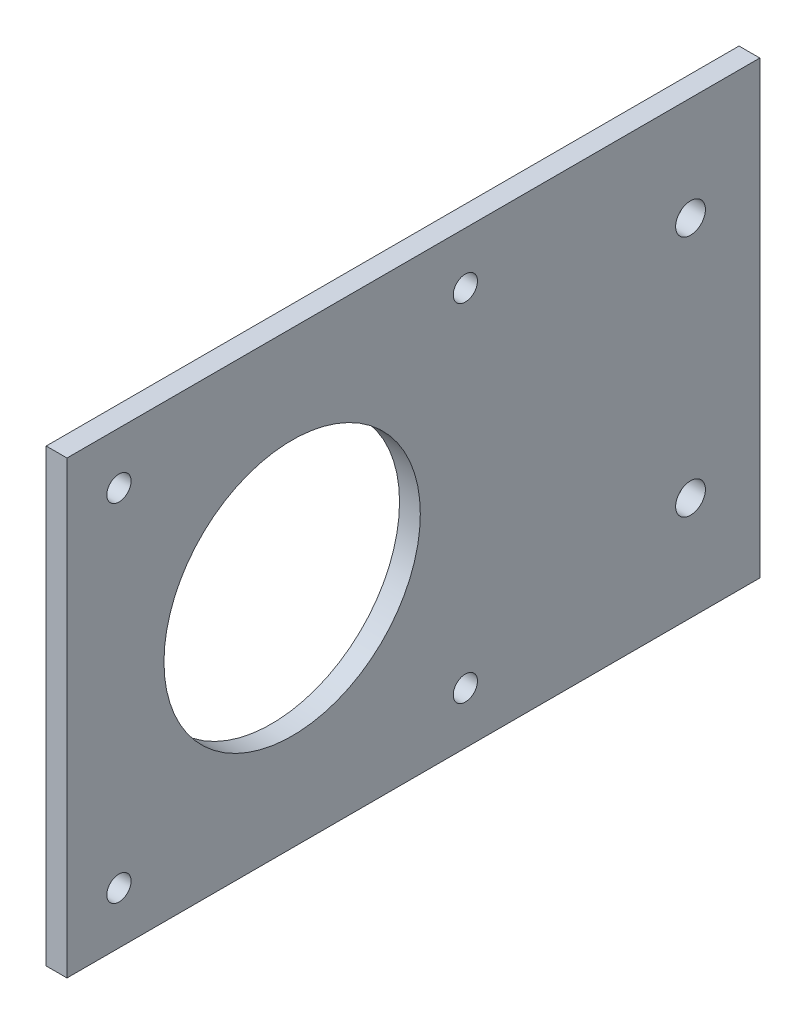
ISO-10303-21;
HEADER;
FILE_DESCRIPTION(('STEP AP214'),'2;1');
FILE_NAME('part.step','',(''),(''),'','','');
FILE_SCHEMA(('AUTOMOTIVE_DESIGN { 1 0 10303 214 1 1 1 1 }'));
ENDSEC;
DATA;
#1=APPLICATION_CONTEXT('core data for automotive mechanical design processes');
#2=APPLICATION_PROTOCOL_DEFINITION('international standard','automotive_design',2000,#1);
#3=PRODUCT_CONTEXT('',#1,'mechanical');
#4=PRODUCT('Part','Part','',(#3));
#5=PRODUCT_RELATED_PRODUCT_CATEGORY('part','',(#4));
#6=PRODUCT_DEFINITION_FORMATION('','',#4);
#7=PRODUCT_DEFINITION_CONTEXT('part definition',#1,'design');
#8=PRODUCT_DEFINITION('design','',#6,#7);
#9=PRODUCT_DEFINITION_SHAPE('','',#8);
#10=(LENGTH_UNIT() NAMED_UNIT(*) SI_UNIT(.MILLI.,.METRE.));
#11=(NAMED_UNIT(*) PLANE_ANGLE_UNIT() SI_UNIT($,.RADIAN.));
#12=(NAMED_UNIT(*) SI_UNIT($,.STERADIAN.) SOLID_ANGLE_UNIT());
#13=UNCERTAINTY_MEASURE_WITH_UNIT(LENGTH_MEASURE(1.E-05),#10,'distance_accuracy_value','');
#14=(GEOMETRIC_REPRESENTATION_CONTEXT(3) GLOBAL_UNCERTAINTY_ASSIGNED_CONTEXT((#13)) GLOBAL_UNIT_ASSIGNED_CONTEXT((#10,
#11,#12)) REPRESENTATION_CONTEXT('',''));
#15=CARTESIAN_POINT('',(0.,0.,0.));
#16=DIRECTION('',(0.,0.,1.));
#17=DIRECTION('',(1.,0.,0.));
#18=AXIS2_PLACEMENT_3D('',#15,#16,#17);
#19=CARTESIAN_POINT('',(3.,0.,0.));
#20=DIRECTION('',(-1.,0.,0.));
#21=DIRECTION('',(0.,0.,1.));
#22=AXIS2_PLACEMENT_3D('',#19,#20,#21);
#23=PLANE('',#22);
#24=DIRECTION('',(0.,-1.,0.));
#25=VECTOR('',#24,1.);
#26=CARTESIAN_POINT('',(3.,0.,0.));
#27=LINE('',#26,#25);
#28=CARTESIAN_POINT('',(3.,65.,0.));
#29=VERTEX_POINT('',#28);
#30=CARTESIAN_POINT('',(3.,0.,0.));
#31=VERTEX_POINT('',#30);
#32=EDGE_CURVE('E102',#29,#31,#27,.T.);
#33=ORIENTED_EDGE('',*,*,#32,.T.);
#34=DIRECTION('',(0.,0.,-1.));
#35=VECTOR('',#34,1.);
#36=CARTESIAN_POINT('',(3.,0.,0.));
#37=LINE('',#36,#35);
#38=CARTESIAN_POINT('',(3.,0.,-100.));
#39=VERTEX_POINT('',#38);
#40=EDGE_CURVE('E97',#31,#39,#37,.T.);
#41=ORIENTED_EDGE('',*,*,#40,.T.);
#42=DIRECTION('',(0.,1.,0.));
#43=VECTOR('',#42,1.);
#44=CARTESIAN_POINT('',(3.,0.,-100.));
#45=LINE('',#44,#43);
#46=CARTESIAN_POINT('',(3.,65.,-100.));
#47=VERTEX_POINT('',#46);
#48=EDGE_CURVE('E100',#39,#47,#45,.T.);
#49=ORIENTED_EDGE('',*,*,#48,.T.);
#50=DIRECTION('',(0.,0.,1.));
#51=VECTOR('',#50,1.);
#52=CARTESIAN_POINT('',(3.,65.,0.));
#53=LINE('',#52,#51);
#54=EDGE_CURVE('E63',#47,#29,#53,.T.);
#55=ORIENTED_EDGE('',*,*,#54,.T.);
#56=EDGE_LOOP('',(#33,#41,#49,#55));
#57=FACE_BOUND('',#56,.T.);
#58=CARTESIAN_POINT('',(3.,32.5,-32.5));
#59=DIRECTION('',(1.,0.,0.));
#60=DIRECTION('',(0.,0.,-1.));
#61=AXIS2_PLACEMENT_3D('',#58,#59,#60);
#62=CIRCLE('',#61,18.5);
#63=CARTESIAN_POINT('',(3.,32.5,-51.));
#64=VERTEX_POINT('',#63);
#65=EDGE_CURVE('E123',#64,#64,#62,.T.);
#66=ORIENTED_EDGE('',*,*,#65,.F.);
#67=EDGE_LOOP('',(#66));
#68=FACE_BOUND('',#67,.T.);
#69=CARTESIAN_POINT('',(3.,57.5,-7.5));
#70=DIRECTION('',(1.,0.,0.));
#71=DIRECTION('',(0.,0.,-1.));
#72=AXIS2_PLACEMENT_3D('',#69,#70,#71);
#73=CIRCLE('',#72,1.75);
#74=CARTESIAN_POINT('',(3.,57.5,-9.25));
#75=VERTEX_POINT('',#74);
#76=EDGE_CURVE('E145',#75,#75,#73,.T.);
#77=ORIENTED_EDGE('',*,*,#76,.F.);
#78=EDGE_LOOP('',(#77));
#79=FACE_BOUND('',#78,.T.);
#80=CARTESIAN_POINT('',(3.,57.5,-57.5));
#81=DIRECTION('',(1.,0.,0.));
#82=DIRECTION('',(0.,0.,-1.));
#83=AXIS2_PLACEMENT_3D('',#80,#81,#82);
#84=CIRCLE('',#83,1.75);
#85=CARTESIAN_POINT('',(3.,57.5,-59.25));
#86=VERTEX_POINT('',#85);
#87=EDGE_CURVE('E152',#86,#86,#84,.T.);
#88=ORIENTED_EDGE('',*,*,#87,.F.);
#89=EDGE_LOOP('',(#88));
#90=FACE_BOUND('',#89,.T.);
#91=CARTESIAN_POINT('',(3.,7.5,-7.5));
#92=DIRECTION('',(1.,0.,0.));
#93=DIRECTION('',(0.,0.,-1.));
#94=AXIS2_PLACEMENT_3D('',#91,#92,#93);
#95=CIRCLE('',#94,1.75);
#96=CARTESIAN_POINT('',(3.,7.5,-9.25));
#97=VERTEX_POINT('',#96);
#98=EDGE_CURVE('E160',#97,#97,#95,.T.);
#99=ORIENTED_EDGE('',*,*,#98,.F.);
#100=EDGE_LOOP('',(#99));
#101=FACE_BOUND('',#100,.T.);
#102=CARTESIAN_POINT('',(3.,7.5,-57.5));
#103=DIRECTION('',(1.,0.,0.));
#104=DIRECTION('',(0.,0.,-1.));
#105=AXIS2_PLACEMENT_3D('',#102,#103,#104);
#106=CIRCLE('',#105,1.75);
#107=CARTESIAN_POINT('',(3.,7.5,-59.25));
#108=VERTEX_POINT('',#107);
#109=EDGE_CURVE('E167',#108,#108,#106,.T.);
#110=ORIENTED_EDGE('',*,*,#109,.F.);
#111=EDGE_LOOP('',(#110));
#112=FACE_BOUND('',#111,.T.);
#113=CARTESIAN_POINT('',(3.,50.,-90.));
#114=DIRECTION('',(1.,0.,0.));
#115=DIRECTION('',(0.,0.,-1.));
#116=AXIS2_PLACEMENT_3D('',#113,#114,#115);
#117=CIRCLE('',#116,2.15);
#118=CARTESIAN_POINT('',(3.,50.,-92.15));
#119=VERTEX_POINT('',#118);
#120=EDGE_CURVE('E173',#119,#119,#117,.T.);
#121=ORIENTED_EDGE('',*,*,#120,.F.);
#122=EDGE_LOOP('',(#121));
#123=FACE_BOUND('',#122,.T.);
#124=CARTESIAN_POINT('',(3.,15.,-90.));
#125=DIRECTION('',(1.,0.,0.));
#126=DIRECTION('',(0.,0.,-1.));
#127=AXIS2_PLACEMENT_3D('',#124,#125,#126);
#128=CIRCLE('',#127,2.15);
#129=CARTESIAN_POINT('',(3.,15.,-92.15));
#130=VERTEX_POINT('',#129);
#131=EDGE_CURVE('E180',#130,#130,#128,.T.);
#132=ORIENTED_EDGE('',*,*,#131,.F.);
#133=EDGE_LOOP('',(#132));
#134=FACE_BOUND('',#133,.T.);
#135=ADVANCED_FACE('F44',(#57,#68,#79,#90,#101,#112,#123,#134),#23,.F.);
#136=CARTESIAN_POINT('',(0.,0.,0.));
#137=DIRECTION('',(-1.,0.,0.));
#138=DIRECTION('',(0.,0.,1.));
#139=AXIS2_PLACEMENT_3D('',#136,#137,#138);
#140=PLANE('',#139);
#141=CARTESIAN_POINT('',(0.,50.,-90.));
#142=DIRECTION('',(1.,0.,0.));
#143=DIRECTION('',(0.,0.,-1.));
#144=AXIS2_PLACEMENT_3D('',#141,#142,#143);
#145=CIRCLE('',#144,2.15);
#146=CARTESIAN_POINT('',(0.,50.,-92.15));
#147=VERTEX_POINT('',#146);
#148=EDGE_CURVE('E176',#147,#147,#145,.T.);
#149=ORIENTED_EDGE('',*,*,#148,.T.);
#150=EDGE_LOOP('',(#149));
#151=FACE_BOUND('',#150,.T.);
#152=CARTESIAN_POINT('',(0.,7.5,-7.5));
#153=DIRECTION('',(1.,0.,0.));
#154=DIRECTION('',(0.,0.,-1.));
#155=AXIS2_PLACEMENT_3D('',#152,#153,#154);
#156=CIRCLE('',#155,1.75);
#157=CARTESIAN_POINT('',(0.,7.5,-9.25));
#158=VERTEX_POINT('',#157);
#159=EDGE_CURVE('E164',#158,#158,#156,.T.);
#160=ORIENTED_EDGE('',*,*,#159,.T.);
#161=EDGE_LOOP('',(#160));
#162=FACE_BOUND('',#161,.T.);
#163=CARTESIAN_POINT('',(0.,57.5,-7.5));
#164=DIRECTION('',(1.,0.,0.));
#165=DIRECTION('',(0.,0.,-1.));
#166=AXIS2_PLACEMENT_3D('',#163,#164,#165);
#167=CIRCLE('',#166,1.75);
#168=CARTESIAN_POINT('',(0.,57.5,-9.25));
#169=VERTEX_POINT('',#168);
#170=EDGE_CURVE('E149',#169,#169,#167,.T.);
#171=ORIENTED_EDGE('',*,*,#170,.T.);
#172=EDGE_LOOP('',(#171));
#173=FACE_BOUND('',#172,.T.);
#174=DIRECTION('',(0.,-1.,0.));
#175=VECTOR('',#174,1.);
#176=CARTESIAN_POINT('',(0.,0.,0.));
#177=LINE('',#176,#175);
#178=CARTESIAN_POINT('',(0.,65.,0.));
#179=VERTEX_POINT('',#178);
#180=CARTESIAN_POINT('',(0.,0.,0.));
#181=VERTEX_POINT('',#180);
#182=EDGE_CURVE('E120',#179,#181,#177,.T.);
#183=ORIENTED_EDGE('',*,*,#182,.F.);
#184=DIRECTION('',(0.,0.,1.));
#185=VECTOR('',#184,1.);
#186=CARTESIAN_POINT('',(0.,65.,0.));
#187=LINE('',#186,#185);
#188=CARTESIAN_POINT('',(0.,65.,-100.));
#189=VERTEX_POINT('',#188);
#190=EDGE_CURVE('E90',#189,#179,#187,.T.);
#191=ORIENTED_EDGE('',*,*,#190,.F.);
#192=DIRECTION('',(0.,1.,0.));
#193=VECTOR('',#192,1.);
#194=CARTESIAN_POINT('',(0.,0.,-100.));
#195=LINE('',#194,#193);
#196=CARTESIAN_POINT('',(0.,0.,-100.));
#197=VERTEX_POINT('',#196);
#198=EDGE_CURVE('E84',#197,#189,#195,.T.);
#199=ORIENTED_EDGE('',*,*,#198,.F.);
#200=DIRECTION('',(0.,0.,-1.));
#201=VECTOR('',#200,1.);
#202=CARTESIAN_POINT('',(0.,0.,0.));
#203=LINE('',#202,#201);
#204=EDGE_CURVE('E107',#181,#197,#203,.T.);
#205=ORIENTED_EDGE('',*,*,#204,.F.);
#206=EDGE_LOOP('',(#183,#191,#199,#205));
#207=FACE_BOUND('',#206,.T.);
#208=CARTESIAN_POINT('',(0.,32.5,-32.5));
#209=DIRECTION('',(1.,0.,0.));
#210=DIRECTION('',(0.,0.,-1.));
#211=AXIS2_PLACEMENT_3D('',#208,#209,#210);
#212=CIRCLE('',#211,18.5);
#213=CARTESIAN_POINT('',(0.,32.5,-51.));
#214=VERTEX_POINT('',#213);
#215=EDGE_CURVE('E141',#214,#214,#212,.T.);
#216=ORIENTED_EDGE('',*,*,#215,.T.);
#217=EDGE_LOOP('',(#216));
#218=FACE_BOUND('',#217,.T.);
#219=CARTESIAN_POINT('',(0.,57.5,-57.5));
#220=DIRECTION('',(1.,0.,0.));
#221=DIRECTION('',(0.,0.,-1.));
#222=AXIS2_PLACEMENT_3D('',#219,#220,#221);
#223=CIRCLE('',#222,1.75);
#224=CARTESIAN_POINT('',(0.,57.5,-59.25));
#225=VERTEX_POINT('',#224);
#226=EDGE_CURVE('E156',#225,#225,#223,.T.);
#227=ORIENTED_EDGE('',*,*,#226,.T.);
#228=EDGE_LOOP('',(#227));
#229=FACE_BOUND('',#228,.T.);
#230=CARTESIAN_POINT('',(0.,7.5,-57.5));
#231=DIRECTION('',(1.,0.,0.));
#232=DIRECTION('',(0.,0.,-1.));
#233=AXIS2_PLACEMENT_3D('',#230,#231,#232);
#234=CIRCLE('',#233,1.75);
#235=CARTESIAN_POINT('',(0.,7.5,-59.25));
#236=VERTEX_POINT('',#235);
#237=EDGE_CURVE('E170',#236,#236,#234,.T.);
#238=ORIENTED_EDGE('',*,*,#237,.T.);
#239=EDGE_LOOP('',(#238));
#240=FACE_BOUND('',#239,.T.);
#241=CARTESIAN_POINT('',(0.,15.,-90.));
#242=DIRECTION('',(1.,0.,0.));
#243=DIRECTION('',(0.,0.,-1.));
#244=AXIS2_PLACEMENT_3D('',#241,#242,#243);
#245=CIRCLE('',#244,2.15);
#246=CARTESIAN_POINT('',(0.,15.,-92.15));
#247=VERTEX_POINT('',#246);
#248=EDGE_CURVE('E184',#247,#247,#245,.T.);
#249=ORIENTED_EDGE('',*,*,#248,.T.);
#250=EDGE_LOOP('',(#249));
#251=FACE_BOUND('',#250,.T.);
#252=ADVANCED_FACE('F135',(#151,#162,#173,#207,#218,#229,#240,#251),#140,.T.);
#253=CARTESIAN_POINT('',(3.,0.,0.));
#254=DIRECTION('',(0.,0.,-1.));
#255=DIRECTION('',(-1.,0.,0.));
#256=AXIS2_PLACEMENT_3D('',#253,#254,#255);
#257=PLANE('',#256);
#258=ORIENTED_EDGE('',*,*,#182,.T.);
#259=DIRECTION('',(-1.,0.,0.));
#260=VECTOR('',#259,1.);
#261=CARTESIAN_POINT('',(3.,0.,0.));
#262=LINE('',#261,#260);
#263=EDGE_CURVE('E11',#31,#181,#262,.T.);
#264=ORIENTED_EDGE('',*,*,#263,.F.);
#265=ORIENTED_EDGE('',*,*,#32,.F.);
#266=DIRECTION('',(-1.,0.,0.));
#267=VECTOR('',#266,1.);
#268=CARTESIAN_POINT('',(3.,65.,0.));
#269=LINE('',#268,#267);
#270=EDGE_CURVE('E116',#29,#179,#269,.T.);
#271=ORIENTED_EDGE('',*,*,#270,.T.);
#272=EDGE_LOOP('',(#258,#264,#265,#271));
#273=FACE_BOUND('',#272,.T.);
#274=ADVANCED_FACE('F46',(#273),#257,.F.);
#275=CARTESIAN_POINT('',(3.,0.,0.));
#276=DIRECTION('',(0.,1.,0.));
#277=DIRECTION('',(0.,0.,1.));
#278=AXIS2_PLACEMENT_3D('',#275,#276,#277);
#279=PLANE('',#278);
#280=ORIENTED_EDGE('',*,*,#204,.T.);
#281=DIRECTION('',(-1.,0.,0.));
#282=VECTOR('',#281,1.);
#283=CARTESIAN_POINT('',(3.,0.,-100.));
#284=LINE('',#283,#282);
#285=EDGE_CURVE('E53',#39,#197,#284,.T.);
#286=ORIENTED_EDGE('',*,*,#285,.F.);
#287=ORIENTED_EDGE('',*,*,#40,.F.);
#288=ORIENTED_EDGE('',*,*,#263,.T.);
#289=EDGE_LOOP('',(#280,#286,#287,#288));
#290=FACE_BOUND('',#289,.T.);
#291=ADVANCED_FACE('F106',(#290),#279,.F.);
#292=CARTESIAN_POINT('',(3.,0.,-100.));
#293=DIRECTION('',(0.,0.,1.));
#294=DIRECTION('',(1.,0.,0.));
#295=AXIS2_PLACEMENT_3D('',#292,#293,#294);
#296=PLANE('',#295);
#297=ORIENTED_EDGE('',*,*,#198,.T.);
#298=DIRECTION('',(-1.,0.,0.));
#299=VECTOR('',#298,1.);
#300=CARTESIAN_POINT('',(3.,65.,-100.));
#301=LINE('',#300,#299);
#302=EDGE_CURVE('E109',#47,#189,#301,.T.);
#303=ORIENTED_EDGE('',*,*,#302,.F.);
#304=ORIENTED_EDGE('',*,*,#48,.F.);
#305=ORIENTED_EDGE('',*,*,#285,.T.);
#306=EDGE_LOOP('',(#297,#303,#304,#305));
#307=FACE_BOUND('',#306,.T.);
#308=ADVANCED_FACE('F110',(#307),#296,.F.);
#309=CARTESIAN_POINT('',(3.,65.,0.));
#310=DIRECTION('',(0.,-1.,0.));
#311=DIRECTION('',(0.,0.,-1.));
#312=AXIS2_PLACEMENT_3D('',#309,#310,#311);
#313=PLANE('',#312);
#314=ORIENTED_EDGE('',*,*,#190,.T.);
#315=ORIENTED_EDGE('',*,*,#270,.F.);
#316=ORIENTED_EDGE('',*,*,#54,.F.);
#317=ORIENTED_EDGE('',*,*,#302,.T.);
#318=EDGE_LOOP('',(#314,#315,#316,#317));
#319=FACE_BOUND('',#318,.T.);
#320=ADVANCED_FACE('F132',(#319),#313,.F.);
#321=CARTESIAN_POINT('',(3.,32.5,-32.5));
#322=DIRECTION('',(-1.,0.,0.));
#323=DIRECTION('',(0.,0.,1.));
#324=AXIS2_PLACEMENT_3D('',#321,#322,#323);
#325=CYLINDRICAL_SURFACE('',#324,18.5);
#326=ORIENTED_EDGE('',*,*,#65,.T.);
#327=EDGE_LOOP('',(#326));
#328=FACE_BOUND('',#327,.T.);
#329=ORIENTED_EDGE('',*,*,#215,.F.);
#330=EDGE_LOOP('',(#329));
#331=FACE_BOUND('',#330,.T.);
#332=ADVANCED_FACE('F203',(#328,#331),#325,.F.);
#333=CARTESIAN_POINT('',(3.,57.5,-7.5));
#334=DIRECTION('',(-1.,0.,0.));
#335=DIRECTION('',(0.,0.,1.));
#336=AXIS2_PLACEMENT_3D('',#333,#334,#335);
#337=CYLINDRICAL_SURFACE('',#336,1.75);
#338=ORIENTED_EDGE('',*,*,#76,.T.);
#339=EDGE_LOOP('',(#338));
#340=FACE_BOUND('',#339,.T.);
#341=ORIENTED_EDGE('',*,*,#170,.F.);
#342=EDGE_LOOP('',(#341));
#343=FACE_BOUND('',#342,.T.);
#344=ADVANCED_FACE('F264',(#340,#343),#337,.F.);
#345=CARTESIAN_POINT('',(3.,57.5,-57.5));
#346=DIRECTION('',(-1.,0.,0.));
#347=DIRECTION('',(0.,0.,1.));
#348=AXIS2_PLACEMENT_3D('',#345,#346,#347);
#349=CYLINDRICAL_SURFACE('',#348,1.75);
#350=ORIENTED_EDGE('',*,*,#87,.T.);
#351=EDGE_LOOP('',(#350));
#352=FACE_BOUND('',#351,.T.);
#353=ORIENTED_EDGE('',*,*,#226,.F.);
#354=EDGE_LOOP('',(#353));
#355=FACE_BOUND('',#354,.T.);
#356=ADVANCED_FACE('F274',(#352,#355),#349,.F.);
#357=CARTESIAN_POINT('',(3.,7.5,-7.5));
#358=DIRECTION('',(-1.,0.,0.));
#359=DIRECTION('',(0.,0.,1.));
#360=AXIS2_PLACEMENT_3D('',#357,#358,#359);
#361=CYLINDRICAL_SURFACE('',#360,1.75);
#362=ORIENTED_EDGE('',*,*,#98,.T.);
#363=EDGE_LOOP('',(#362));
#364=FACE_BOUND('',#363,.T.);
#365=ORIENTED_EDGE('',*,*,#159,.F.);
#366=EDGE_LOOP('',(#365));
#367=FACE_BOUND('',#366,.T.);
#368=ADVANCED_FACE('F284',(#364,#367),#361,.F.);
#369=CARTESIAN_POINT('',(3.,7.5,-57.5));
#370=DIRECTION('',(-1.,0.,0.));
#371=DIRECTION('',(0.,0.,1.));
#372=AXIS2_PLACEMENT_3D('',#369,#370,#371);
#373=CYLINDRICAL_SURFACE('',#372,1.75);
#374=ORIENTED_EDGE('',*,*,#109,.T.);
#375=EDGE_LOOP('',(#374));
#376=FACE_BOUND('',#375,.T.);
#377=ORIENTED_EDGE('',*,*,#237,.F.);
#378=EDGE_LOOP('',(#377));
#379=FACE_BOUND('',#378,.T.);
#380=ADVANCED_FACE('F295',(#376,#379),#373,.F.);
#381=CARTESIAN_POINT('',(3.,50.,-90.));
#382=DIRECTION('',(-1.,0.,0.));
#383=DIRECTION('',(0.,0.,1.));
#384=AXIS2_PLACEMENT_3D('',#381,#382,#383);
#385=CYLINDRICAL_SURFACE('',#384,2.15);
#386=ORIENTED_EDGE('',*,*,#120,.T.);
#387=EDGE_LOOP('',(#386));
#388=FACE_BOUND('',#387,.T.);
#389=ORIENTED_EDGE('',*,*,#148,.F.);
#390=EDGE_LOOP('',(#389));
#391=FACE_BOUND('',#390,.T.);
#392=ADVANCED_FACE('F306',(#388,#391),#385,.F.);
#393=CARTESIAN_POINT('',(3.,15.,-90.));
#394=DIRECTION('',(-1.,0.,0.));
#395=DIRECTION('',(0.,0.,1.));
#396=AXIS2_PLACEMENT_3D('',#393,#394,#395);
#397=CYLINDRICAL_SURFACE('',#396,2.15);
#398=ORIENTED_EDGE('',*,*,#131,.T.);
#399=EDGE_LOOP('',(#398));
#400=FACE_BOUND('',#399,.T.);
#401=ORIENTED_EDGE('',*,*,#248,.F.);
#402=EDGE_LOOP('',(#401));
#403=FACE_BOUND('',#402,.T.);
#404=ADVANCED_FACE('F192',(#400,#403),#397,.F.);
#405=CLOSED_SHELL('',(#135,#252,#274,#291,#308,#320,#332,#344,#356,#368,#380,#392,#404));
#406=MANIFOLD_SOLID_BREP('B2',#405);
#407=ADVANCED_BREP_SHAPE_REPRESENTATION('',(#18,#406),#14);
#408=SHAPE_DEFINITION_REPRESENTATION(#9,#407);
ENDSEC;
END-ISO-10303-21;
